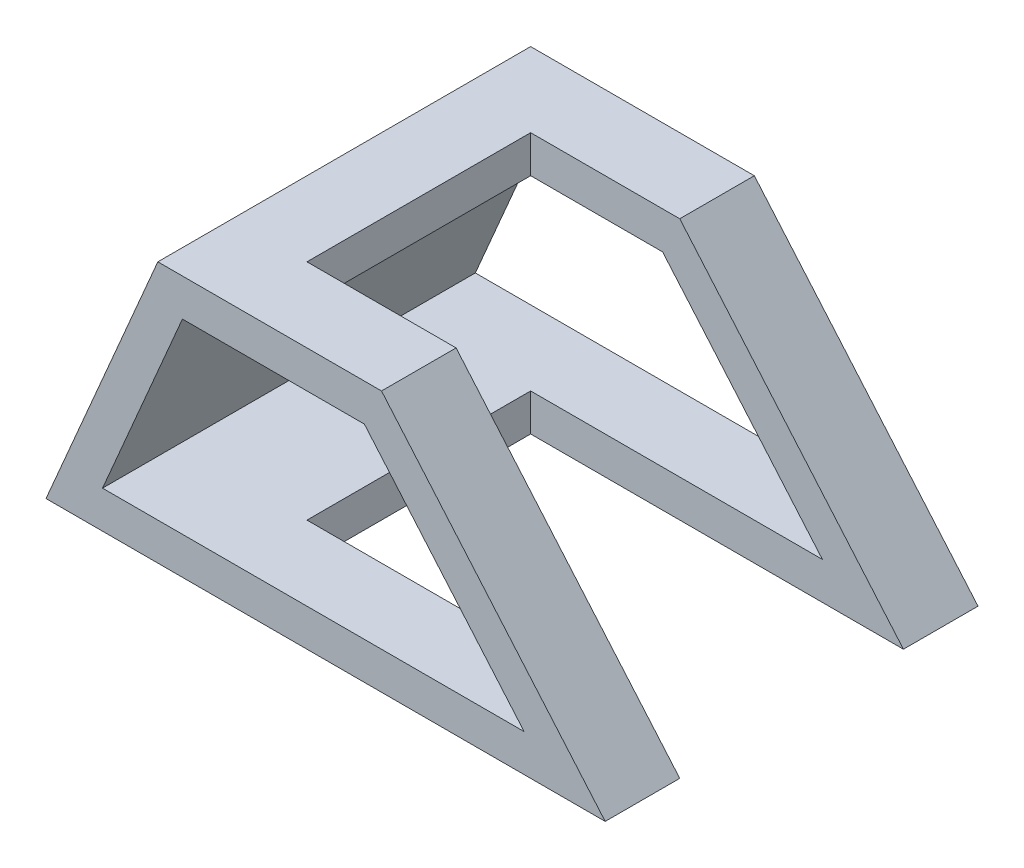
ISO-10303-21;
HEADER;
FILE_DESCRIPTION(('STEP AP214'),'2;1');
FILE_NAME('part.step','',(''),(''),'','','');
FILE_SCHEMA(('AUTOMOTIVE_DESIGN { 1 0 10303 214 1 1 1 1 }'));
ENDSEC;
DATA;
#1=APPLICATION_CONTEXT('core data for automotive mechanical design processes');
#2=APPLICATION_PROTOCOL_DEFINITION('international standard','automotive_design',2000,#1);
#3=PRODUCT_CONTEXT('',#1,'mechanical');
#4=PRODUCT('Part','Part','',(#3));
#5=PRODUCT_RELATED_PRODUCT_CATEGORY('part','',(#4));
#6=PRODUCT_DEFINITION_FORMATION('','',#4);
#7=PRODUCT_DEFINITION_CONTEXT('part definition',#1,'design');
#8=PRODUCT_DEFINITION('design','',#6,#7);
#9=PRODUCT_DEFINITION_SHAPE('','',#8);
#10=(LENGTH_UNIT() NAMED_UNIT(*) SI_UNIT(.MILLI.,.METRE.));
#11=(NAMED_UNIT(*) PLANE_ANGLE_UNIT() SI_UNIT($,.RADIAN.));
#12=(NAMED_UNIT(*) SI_UNIT($,.STERADIAN.) SOLID_ANGLE_UNIT());
#13=UNCERTAINTY_MEASURE_WITH_UNIT(LENGTH_MEASURE(1.E-05),#10,'distance_accuracy_value','');
#14=(GEOMETRIC_REPRESENTATION_CONTEXT(3) GLOBAL_UNCERTAINTY_ASSIGNED_CONTEXT((#13)) GLOBAL_UNIT_ASSIGNED_CONTEXT((#10,
#11,#12)) REPRESENTATION_CONTEXT('',''));
#15=CARTESIAN_POINT('',(0.,0.,0.));
#16=DIRECTION('',(0.,0.,1.));
#17=DIRECTION('',(1.,0.,0.));
#18=AXIS2_PLACEMENT_3D('',#15,#16,#17);
#19=CARTESIAN_POINT('',(150.,0.,100.));
#20=DIRECTION('',(-0.759256602365297,-0.650791373455968,0.));
#21=DIRECTION('',(0.650791373455968,-0.759256602365297,0.));
#22=AXIS2_PLACEMENT_3D('',#19,#20,#21);
#23=PLANE('',#22);
#24=DIRECTION('',(0.,0.,-1.));
#25=VECTOR('',#24,1.);
#26=CARTESIAN_POINT('',(90.,70.,100.));
#27=LINE('',#26,#25);
#28=CARTESIAN_POINT('',(90.,70.,20.));
#29=VERTEX_POINT('',#28);
#30=CARTESIAN_POINT('',(90.,70.,0.));
#31=VERTEX_POINT('',#30);
#32=EDGE_CURVE('E178',#29,#31,#27,.T.);
#33=ORIENTED_EDGE('',*,*,#32,.F.);
#34=DIRECTION('',(-0.650791373455968,0.759256602365297,0.));
#35=VECTOR('',#34,1.);
#36=CARTESIAN_POINT('',(150.,0.,20.));
#37=LINE('',#36,#35);
#38=CARTESIAN_POINT('',(150.,0.,20.));
#39=VERTEX_POINT('',#38);
#40=EDGE_CURVE('E161',#39,#29,#37,.T.);
#41=ORIENTED_EDGE('',*,*,#40,.F.);
#42=DIRECTION('',(0.,0.,-1.));
#43=VECTOR('',#42,1.);
#44=CARTESIAN_POINT('',(150.,0.,100.));
#45=LINE('',#44,#43);
#46=CARTESIAN_POINT('',(150.,0.,0.));
#47=VERTEX_POINT('',#46);
#48=EDGE_CURVE('E177',#39,#47,#45,.T.);
#49=ORIENTED_EDGE('',*,*,#48,.T.);
#50=DIRECTION('',(-0.650791373455968,0.759256602365297,0.));
#51=VECTOR('',#50,1.);
#52=CARTESIAN_POINT('',(150.,0.,0.));
#53=LINE('',#52,#51);
#54=EDGE_CURVE('E238',#47,#31,#53,.T.);
#55=ORIENTED_EDGE('',*,*,#54,.T.);
#56=EDGE_LOOP('',(#33,#41,#49,#55));
#57=FACE_BOUND('',#56,.T.);
#58=ADVANCED_FACE('F36',(#57),#23,.F.);
#59=CARTESIAN_POINT('',(128.257793632439,10.,100.));
#60=DIRECTION('',(-0.759256602365297,-0.650791373455968,0.));
#61=DIRECTION('',(0.650791373455968,-0.759256602365297,0.));
#62=AXIS2_PLACEMENT_3D('',#59,#60,#61);
#63=PLANE('',#62);
#64=DIRECTION('',(0.,0.,-1.));
#65=VECTOR('',#64,1.);
#66=CARTESIAN_POINT('',(128.257793632439,10.,100.));
#67=LINE('',#66,#65);
#68=CARTESIAN_POINT('',(128.257793632439,10.,20.));
#69=VERTEX_POINT('',#68);
#70=CARTESIAN_POINT('',(128.257793632439,10.,0.));
#71=VERTEX_POINT('',#70);
#72=EDGE_CURVE('E209',#69,#71,#67,.T.);
#73=ORIENTED_EDGE('',*,*,#72,.F.);
#74=DIRECTION('',(0.650791373455968,-0.759256602365297,0.));
#75=VECTOR('',#74,1.);
#76=CARTESIAN_POINT('',(128.257793632439,10.,20.));
#77=LINE('',#76,#75);
#78=CARTESIAN_POINT('',(85.4006507752959,60.,20.));
#79=VERTEX_POINT('',#78);
#80=EDGE_CURVE('E188',#79,#69,#77,.T.);
#81=ORIENTED_EDGE('',*,*,#80,.F.);
#82=DIRECTION('',(0.,0.,-1.));
#83=VECTOR('',#82,1.);
#84=CARTESIAN_POINT('',(85.4006507752959,60.,100.));
#85=LINE('',#84,#83);
#86=CARTESIAN_POINT('',(85.4006507752959,60.,0.));
#87=VERTEX_POINT('',#86);
#88=EDGE_CURVE('E210',#79,#87,#85,.T.);
#89=ORIENTED_EDGE('',*,*,#88,.T.);
#90=DIRECTION('',(-0.650791373455968,0.759256602365297,0.));
#91=VECTOR('',#90,1.);
#92=CARTESIAN_POINT('',(128.257793632439,10.,0.));
#93=LINE('',#92,#91);
#94=EDGE_CURVE('E215',#71,#87,#93,.T.);
#95=ORIENTED_EDGE('',*,*,#94,.F.);
#96=EDGE_LOOP('',(#73,#81,#89,#95));
#97=FACE_BOUND('',#96,.T.);
#98=ADVANCED_FACE('F257',(#97),#63,.T.);
#99=CARTESIAN_POINT('',(0.,0.,100.));
#100=DIRECTION('',(0.,0.,1.));
#101=DIRECTION('',(1.,0.,0.));
#102=AXIS2_PLACEMENT_3D('',#99,#100,#101);
#103=PLANE('',#102);
#104=DIRECTION('',(-0.393919298579168,-0.919145030018058,0.));
#105=VECTOR('',#104,1.);
#106=CARTESIAN_POINT('',(30.,70.,100.));
#107=LINE('',#106,#105);
#108=CARTESIAN_POINT('',(30.,70.,100.));
#109=VERTEX_POINT('',#108);
#110=CARTESIAN_POINT('',(0.,0.,100.));
#111=VERTEX_POINT('',#110);
#112=EDGE_CURVE('E224',#109,#111,#107,.T.);
#113=ORIENTED_EDGE('',*,*,#112,.T.);
#114=DIRECTION('',(1.,0.,0.));
#115=VECTOR('',#114,1.);
#116=CARTESIAN_POINT('',(0.,0.,100.));
#117=LINE('',#116,#115);
#118=CARTESIAN_POINT('',(150.,0.,100.));
#119=VERTEX_POINT('',#118);
#120=EDGE_CURVE('E227',#111,#119,#117,.T.);
#121=ORIENTED_EDGE('',*,*,#120,.T.);
#122=DIRECTION('',(-0.650791373455968,0.759256602365297,0.));
#123=VECTOR('',#122,1.);
#124=CARTESIAN_POINT('',(150.,0.,100.));
#125=LINE('',#124,#123);
#126=CARTESIAN_POINT('',(90.,70.,100.));
#127=VERTEX_POINT('',#126);
#128=EDGE_CURVE('E230',#119,#127,#125,.T.);
#129=ORIENTED_EDGE('',*,*,#128,.T.);
#130=DIRECTION('',(-1.,0.,0.));
#131=VECTOR('',#130,1.);
#132=CARTESIAN_POINT('',(90.,70.,100.));
#133=LINE('',#132,#131);
#134=EDGE_CURVE('E176',#127,#109,#133,.T.);
#135=ORIENTED_EDGE('',*,*,#134,.T.);
#136=EDGE_LOOP('',(#113,#121,#129,#135));
#137=FACE_BOUND('',#136,.T.);
#138=DIRECTION('',(-0.393919298579168,-0.919145030018058,0.));
#139=VECTOR('',#138,1.);
#140=CARTESIAN_POINT('',(36.5939615798056,60.,100.));
#141=LINE('',#140,#139);
#142=CARTESIAN_POINT('',(36.5939615798056,60.,100.));
#143=VERTEX_POINT('',#142);
#144=CARTESIAN_POINT('',(15.1653901512342,10.,100.));
#145=VERTEX_POINT('',#144);
#146=EDGE_CURVE('E261',#143,#145,#141,.T.);
#147=ORIENTED_EDGE('',*,*,#146,.F.);
#148=DIRECTION('',(-1.,0.,0.));
#149=VECTOR('',#148,1.);
#150=CARTESIAN_POINT('',(85.4006507752959,60.,100.));
#151=LINE('',#150,#149);
#152=CARTESIAN_POINT('',(85.4006507752959,60.,100.));
#153=VERTEX_POINT('',#152);
#154=EDGE_CURVE('E262',#153,#143,#151,.T.);
#155=ORIENTED_EDGE('',*,*,#154,.F.);
#156=DIRECTION('',(-0.650791373455968,0.759256602365297,0.));
#157=VECTOR('',#156,1.);
#158=CARTESIAN_POINT('',(128.257793632439,10.,100.));
#159=LINE('',#158,#157);
#160=CARTESIAN_POINT('',(128.257793632439,10.,100.));
#161=VERTEX_POINT('',#160);
#162=EDGE_CURVE('E208',#161,#153,#159,.T.);
#163=ORIENTED_EDGE('',*,*,#162,.F.);
#164=DIRECTION('',(1.,0.,0.));
#165=VECTOR('',#164,1.);
#166=CARTESIAN_POINT('',(15.1653901512342,10.,100.));
#167=LINE('',#166,#165);
#168=EDGE_CURVE('E264',#145,#161,#167,.T.);
#169=ORIENTED_EDGE('',*,*,#168,.F.);
#170=EDGE_LOOP('',(#147,#155,#163,#169));
#171=FACE_BOUND('',#170,.T.);
#172=ADVANCED_FACE('F254',(#137,#171),#103,.T.);
#173=CARTESIAN_POINT('',(0.,0.,0.));
#174=DIRECTION('',(0.,0.,1.));
#175=DIRECTION('',(1.,0.,0.));
#176=AXIS2_PLACEMENT_3D('',#173,#174,#175);
#177=PLANE('',#176);
#178=DIRECTION('',(-0.393919298579168,-0.919145030018058,0.));
#179=VECTOR('',#178,1.);
#180=CARTESIAN_POINT('',(30.,70.,0.));
#181=LINE('',#180,#179);
#182=CARTESIAN_POINT('',(30.,70.,0.));
#183=VERTEX_POINT('',#182);
#184=CARTESIAN_POINT('',(0.,0.,0.));
#185=VERTEX_POINT('',#184);
#186=EDGE_CURVE('E223',#183,#185,#181,.T.);
#187=ORIENTED_EDGE('',*,*,#186,.F.);
#188=DIRECTION('',(-1.,0.,0.));
#189=VECTOR('',#188,1.);
#190=CARTESIAN_POINT('',(90.,70.,0.));
#191=LINE('',#190,#189);
#192=EDGE_CURVE('E228',#31,#183,#191,.T.);
#193=ORIENTED_EDGE('',*,*,#192,.F.);
#194=ORIENTED_EDGE('',*,*,#54,.F.);
#195=DIRECTION('',(1.,0.,0.));
#196=VECTOR('',#195,1.);
#197=CARTESIAN_POINT('',(0.,0.,0.));
#198=LINE('',#197,#196);
#199=EDGE_CURVE('E235',#185,#47,#198,.T.);
#200=ORIENTED_EDGE('',*,*,#199,.F.);
#201=EDGE_LOOP('',(#187,#193,#194,#200));
#202=FACE_BOUND('',#201,.T.);
#203=DIRECTION('',(-1.,0.,0.));
#204=VECTOR('',#203,1.);
#205=CARTESIAN_POINT('',(85.4006507752959,60.,0.));
#206=LINE('',#205,#204);
#207=CARTESIAN_POINT('',(36.5939615798056,60.,0.));
#208=VERTEX_POINT('',#207);
#209=EDGE_CURVE('E274',#87,#208,#206,.T.);
#210=ORIENTED_EDGE('',*,*,#209,.T.);
#211=DIRECTION('',(-0.393919298579168,-0.919145030018058,0.));
#212=VECTOR('',#211,1.);
#213=CARTESIAN_POINT('',(36.5939615798056,60.,0.));
#214=LINE('',#213,#212);
#215=CARTESIAN_POINT('',(15.1653901512342,10.,0.));
#216=VERTEX_POINT('',#215);
#217=EDGE_CURVE('E277',#208,#216,#214,.T.);
#218=ORIENTED_EDGE('',*,*,#217,.T.);
#219=DIRECTION('',(1.,0.,0.));
#220=VECTOR('',#219,1.);
#221=CARTESIAN_POINT('',(15.1653901512342,10.,0.));
#222=LINE('',#221,#220);
#223=EDGE_CURVE('E280',#216,#71,#222,.T.);
#224=ORIENTED_EDGE('',*,*,#223,.T.);
#225=ORIENTED_EDGE('',*,*,#94,.T.);
#226=EDGE_LOOP('',(#210,#218,#224,#225));
#227=FACE_BOUND('',#226,.T.);
#228=ADVANCED_FACE('F250',(#202,#227),#177,.F.);
#229=CARTESIAN_POINT('',(30.,70.,100.));
#230=DIRECTION('',(0.919145030018058,-0.393919298579168,0.));
#231=DIRECTION('',(0.393919298579168,0.919145030018058,0.));
#232=AXIS2_PLACEMENT_3D('',#229,#230,#231);
#233=PLANE('',#232);
#234=ORIENTED_EDGE('',*,*,#186,.T.);
#235=DIRECTION('',(0.,0.,-1.));
#236=VECTOR('',#235,1.);
#237=CARTESIAN_POINT('',(0.,0.,100.));
#238=LINE('',#237,#236);
#239=EDGE_CURVE('E185',#111,#185,#238,.T.);
#240=ORIENTED_EDGE('',*,*,#239,.F.);
#241=ORIENTED_EDGE('',*,*,#112,.F.);
#242=DIRECTION('',(0.,0.,-1.));
#243=VECTOR('',#242,1.);
#244=CARTESIAN_POINT('',(30.,70.,100.));
#245=LINE('',#244,#243);
#246=EDGE_CURVE('E181',#109,#183,#245,.T.);
#247=ORIENTED_EDGE('',*,*,#246,.T.);
#248=EDGE_LOOP('',(#234,#240,#241,#247));
#249=FACE_BOUND('',#248,.T.);
#250=ADVANCED_FACE('F38',(#249),#233,.F.);
#251=CARTESIAN_POINT('',(0.,0.,100.));
#252=DIRECTION('',(0.,1.,0.));
#253=DIRECTION('',(0.,0.,1.));
#254=AXIS2_PLACEMENT_3D('',#251,#252,#253);
#255=PLANE('',#254);
#256=ORIENTED_EDGE('',*,*,#48,.F.);
#257=DIRECTION('',(-1.,0.,0.));
#258=VECTOR('',#257,1.);
#259=CARTESIAN_POINT('',(0.,0.,20.));
#260=LINE('',#259,#258);
#261=CARTESIAN_POINT('',(50.,0.,20.));
#262=VERTEX_POINT('',#261);
#263=EDGE_CURVE('E51',#39,#262,#260,.T.);
#264=ORIENTED_EDGE('',*,*,#263,.T.);
#265=DIRECTION('',(0.,0.,1.));
#266=VECTOR('',#265,1.);
#267=CARTESIAN_POINT('',(50.,0.,100.));
#268=LINE('',#267,#266);
#269=CARTESIAN_POINT('',(50.,0.,80.));
#270=VERTEX_POINT('',#269);
#271=EDGE_CURVE('E278',#262,#270,#268,.T.);
#272=ORIENTED_EDGE('',*,*,#271,.T.);
#273=DIRECTION('',(1.,0.,0.));
#274=VECTOR('',#273,1.);
#275=CARTESIAN_POINT('',(0.,0.,80.));
#276=LINE('',#275,#274);
#277=CARTESIAN_POINT('',(150.,0.,80.));
#278=VERTEX_POINT('',#277);
#279=EDGE_CURVE('E303',#270,#278,#276,.T.);
#280=ORIENTED_EDGE('',*,*,#279,.T.);
#281=EDGE_CURVE('E159',#119,#278,#45,.T.);
#282=ORIENTED_EDGE('',*,*,#281,.F.);
#283=ORIENTED_EDGE('',*,*,#120,.F.);
#284=ORIENTED_EDGE('',*,*,#239,.T.);
#285=ORIENTED_EDGE('',*,*,#199,.T.);
#286=EDGE_LOOP('',(#256,#264,#272,#280,#282,#283,#284,#285));
#287=FACE_BOUND('',#286,.T.);
#288=ADVANCED_FACE('F252',(#287),#255,.F.);
#289=ORIENTED_EDGE('',*,*,#281,.T.);
#290=DIRECTION('',(0.650791373455968,-0.759256602365297,0.));
#291=VECTOR('',#290,1.);
#292=CARTESIAN_POINT('',(90.,70.,80.));
#293=LINE('',#292,#291);
#294=CARTESIAN_POINT('',(90.,70.,80.));
#295=VERTEX_POINT('',#294);
#296=EDGE_CURVE('E151',#295,#278,#293,.T.);
#297=ORIENTED_EDGE('',*,*,#296,.F.);
#298=EDGE_CURVE('E156',#127,#295,#27,.T.);
#299=ORIENTED_EDGE('',*,*,#298,.F.);
#300=ORIENTED_EDGE('',*,*,#128,.F.);
#301=EDGE_LOOP('',(#289,#297,#299,#300));
#302=FACE_BOUND('',#301,.T.);
#303=ADVANCED_FACE('F153',(#302),#23,.F.);
#304=CARTESIAN_POINT('',(90.,70.,100.));
#305=DIRECTION('',(0.,-1.,0.));
#306=DIRECTION('',(1.,0.,0.));
#307=AXIS2_PLACEMENT_3D('',#304,#305,#306);
#308=PLANE('',#307);
#309=ORIENTED_EDGE('',*,*,#298,.T.);
#310=DIRECTION('',(1.,0.,0.));
#311=VECTOR('',#310,1.);
#312=CARTESIAN_POINT('',(50.,70.,80.));
#313=LINE('',#312,#311);
#314=CARTESIAN_POINT('',(50.,70.,80.));
#315=VERTEX_POINT('',#314);
#316=EDGE_CURVE('E164',#315,#295,#313,.T.);
#317=ORIENTED_EDGE('',*,*,#316,.F.);
#318=DIRECTION('',(0.,0.,1.));
#319=VECTOR('',#318,1.);
#320=CARTESIAN_POINT('',(50.,70.,20.));
#321=LINE('',#320,#319);
#322=CARTESIAN_POINT('',(50.,70.,20.));
#323=VERTEX_POINT('',#322);
#324=EDGE_CURVE('E172',#323,#315,#321,.T.);
#325=ORIENTED_EDGE('',*,*,#324,.F.);
#326=DIRECTION('',(-1.,0.,0.));
#327=VECTOR('',#326,1.);
#328=CARTESIAN_POINT('',(90.,70.,20.));
#329=LINE('',#328,#327);
#330=EDGE_CURVE('E315',#29,#323,#329,.T.);
#331=ORIENTED_EDGE('',*,*,#330,.F.);
#332=ORIENTED_EDGE('',*,*,#32,.T.);
#333=ORIENTED_EDGE('',*,*,#192,.T.);
#334=ORIENTED_EDGE('',*,*,#246,.F.);
#335=ORIENTED_EDGE('',*,*,#134,.F.);
#336=EDGE_LOOP('',(#309,#317,#325,#331,#332,#333,#334,#335));
#337=FACE_BOUND('',#336,.T.);
#338=ADVANCED_FACE('F174',(#337),#308,.F.);
#339=CARTESIAN_POINT('',(85.4006507752959,60.,100.));
#340=DIRECTION('',(0.,-1.,0.));
#341=DIRECTION('',(0.,0.,-1.));
#342=AXIS2_PLACEMENT_3D('',#339,#340,#341);
#343=PLANE('',#342);
#344=DIRECTION('',(-1.,0.,0.));
#345=VECTOR('',#344,1.);
#346=CARTESIAN_POINT('',(85.4006507752959,60.,80.));
#347=LINE('',#346,#345);
#348=CARTESIAN_POINT('',(85.4006507752959,60.,80.));
#349=VERTEX_POINT('',#348);
#350=CARTESIAN_POINT('',(50.,60.,80.));
#351=VERTEX_POINT('',#350);
#352=EDGE_CURVE('E191',#349,#351,#347,.T.);
#353=ORIENTED_EDGE('',*,*,#352,.F.);
#354=EDGE_CURVE('E202',#153,#349,#85,.T.);
#355=ORIENTED_EDGE('',*,*,#354,.F.);
#356=ORIENTED_EDGE('',*,*,#154,.T.);
#357=DIRECTION('',(0.,0.,-1.));
#358=VECTOR('',#357,1.);
#359=CARTESIAN_POINT('',(36.5939615798056,60.,100.));
#360=LINE('',#359,#358);
#361=EDGE_CURVE('E220',#143,#208,#360,.T.);
#362=ORIENTED_EDGE('',*,*,#361,.T.);
#363=ORIENTED_EDGE('',*,*,#209,.F.);
#364=ORIENTED_EDGE('',*,*,#88,.F.);
#365=DIRECTION('',(1.,0.,0.));
#366=VECTOR('',#365,1.);
#367=CARTESIAN_POINT('',(85.4006507752959,60.,20.));
#368=LINE('',#367,#366);
#369=CARTESIAN_POINT('',(50.,60.,20.));
#370=VERTEX_POINT('',#369);
#371=EDGE_CURVE('E59',#370,#79,#368,.T.);
#372=ORIENTED_EDGE('',*,*,#371,.F.);
#373=DIRECTION('',(0.,0.,-1.));
#374=VECTOR('',#373,1.);
#375=CARTESIAN_POINT('',(50.,60.,100.));
#376=LINE('',#375,#374);
#377=EDGE_CURVE('E204',#351,#370,#376,.T.);
#378=ORIENTED_EDGE('',*,*,#377,.F.);
#379=EDGE_LOOP('',(#353,#355,#356,#362,#363,#364,#372,#378));
#380=FACE_BOUND('',#379,.T.);
#381=ADVANCED_FACE('F201',(#380),#343,.T.);
#382=CARTESIAN_POINT('',(36.5939615798056,60.,100.));
#383=DIRECTION('',(0.919145030018058,-0.393919298579168,0.));
#384=DIRECTION('',(0.393919298579168,0.919145030018058,0.));
#385=AXIS2_PLACEMENT_3D('',#382,#383,#384);
#386=PLANE('',#385);
#387=ORIENTED_EDGE('',*,*,#217,.F.);
#388=ORIENTED_EDGE('',*,*,#361,.F.);
#389=ORIENTED_EDGE('',*,*,#146,.T.);
#390=DIRECTION('',(0.,0.,-1.));
#391=VECTOR('',#390,1.);
#392=CARTESIAN_POINT('',(15.1653901512342,10.,100.));
#393=LINE('',#392,#391);
#394=EDGE_CURVE('E218',#145,#216,#393,.T.);
#395=ORIENTED_EDGE('',*,*,#394,.T.);
#396=EDGE_LOOP('',(#387,#388,#389,#395));
#397=FACE_BOUND('',#396,.T.);
#398=ADVANCED_FACE('F289',(#397),#386,.T.);
#399=CARTESIAN_POINT('',(15.1653901512342,10.,100.));
#400=DIRECTION('',(0.,1.,0.));
#401=DIRECTION('',(-1.,0.,0.));
#402=AXIS2_PLACEMENT_3D('',#399,#400,#401);
#403=PLANE('',#402);
#404=DIRECTION('',(-1.,0.,0.));
#405=VECTOR('',#404,1.);
#406=CARTESIAN_POINT('',(15.1653901512342,10.,20.));
#407=LINE('',#406,#405);
#408=CARTESIAN_POINT('',(50.,10.,20.));
#409=VERTEX_POINT('',#408);
#410=EDGE_CURVE('E294',#69,#409,#407,.T.);
#411=ORIENTED_EDGE('',*,*,#410,.F.);
#412=ORIENTED_EDGE('',*,*,#72,.T.);
#413=ORIENTED_EDGE('',*,*,#223,.F.);
#414=ORIENTED_EDGE('',*,*,#394,.F.);
#415=ORIENTED_EDGE('',*,*,#168,.T.);
#416=CARTESIAN_POINT('',(128.257793632439,10.,80.));
#417=VERTEX_POINT('',#416);
#418=EDGE_CURVE('E212',#161,#417,#67,.T.);
#419=ORIENTED_EDGE('',*,*,#418,.T.);
#420=DIRECTION('',(1.,0.,0.));
#421=VECTOR('',#420,1.);
#422=CARTESIAN_POINT('',(15.1653901512342,10.,80.));
#423=LINE('',#422,#421);
#424=CARTESIAN_POINT('',(50.,10.,80.));
#425=VERTEX_POINT('',#424);
#426=EDGE_CURVE('E194',#425,#417,#423,.T.);
#427=ORIENTED_EDGE('',*,*,#426,.F.);
#428=DIRECTION('',(0.,0.,1.));
#429=VECTOR('',#428,1.);
#430=CARTESIAN_POINT('',(50.,10.,100.));
#431=LINE('',#430,#429);
#432=EDGE_CURVE('E11',#409,#425,#431,.T.);
#433=ORIENTED_EDGE('',*,*,#432,.F.);
#434=EDGE_LOOP('',(#411,#412,#413,#414,#415,#419,#427,#433));
#435=FACE_BOUND('',#434,.T.);
#436=ADVANCED_FACE('F292',(#435),#403,.T.);
#437=DIRECTION('',(-0.650791373455968,0.759256602365297,0.));
#438=VECTOR('',#437,1.);
#439=CARTESIAN_POINT('',(128.257793632439,10.,80.));
#440=LINE('',#439,#438);
#441=EDGE_CURVE('E44',#417,#349,#440,.T.);
#442=ORIENTED_EDGE('',*,*,#441,.F.);
#443=ORIENTED_EDGE('',*,*,#418,.F.);
#444=ORIENTED_EDGE('',*,*,#162,.T.);
#445=ORIENTED_EDGE('',*,*,#354,.T.);
#446=EDGE_LOOP('',(#442,#443,#444,#445));
#447=FACE_BOUND('',#446,.T.);
#448=ADVANCED_FACE('F206',(#447),#63,.T.);
#449=CARTESIAN_POINT('',(50.,-30.,20.));
#450=DIRECTION('',(-1.,0.,0.));
#451=DIRECTION('',(0.,0.,1.));
#452=AXIS2_PLACEMENT_3D('',#449,#450,#451);
#453=PLANE('',#452);
#454=ORIENTED_EDGE('',*,*,#377,.T.);
#455=DIRECTION('',(0.,1.,0.));
#456=VECTOR('',#455,1.);
#457=CARTESIAN_POINT('',(50.,-30.,20.));
#458=LINE('',#457,#456);
#459=EDGE_CURVE('E171',#370,#323,#458,.T.);
#460=ORIENTED_EDGE('',*,*,#459,.T.);
#461=ORIENTED_EDGE('',*,*,#324,.T.);
#462=DIRECTION('',(0.,1.,0.));
#463=VECTOR('',#462,1.);
#464=CARTESIAN_POINT('',(50.,-30.,80.));
#465=LINE('',#464,#463);
#466=EDGE_CURVE('E167',#351,#315,#465,.T.);
#467=ORIENTED_EDGE('',*,*,#466,.F.);
#468=EDGE_LOOP('',(#454,#460,#461,#467));
#469=FACE_BOUND('',#468,.T.);
#470=ADVANCED_FACE('F314',(#469),#453,.F.);
#471=EDGE_CURVE('E309',#262,#409,#458,.T.);
#472=ORIENTED_EDGE('',*,*,#471,.T.);
#473=ORIENTED_EDGE('',*,*,#432,.T.);
#474=EDGE_CURVE('E298',#270,#425,#465,.T.);
#475=ORIENTED_EDGE('',*,*,#474,.F.);
#476=ORIENTED_EDGE('',*,*,#271,.F.);
#477=EDGE_LOOP('',(#472,#473,#475,#476));
#478=FACE_BOUND('',#477,.T.);
#479=ADVANCED_FACE('F308',(#478),#453,.F.);
#480=CARTESIAN_POINT('',(50.,-30.,80.));
#481=DIRECTION('',(0.,0.,1.));
#482=DIRECTION('',(1.,0.,0.));
#483=AXIS2_PLACEMENT_3D('',#480,#481,#482);
#484=PLANE('',#483);
#485=ORIENTED_EDGE('',*,*,#296,.T.);
#486=ORIENTED_EDGE('',*,*,#279,.F.);
#487=ORIENTED_EDGE('',*,*,#474,.T.);
#488=ORIENTED_EDGE('',*,*,#426,.T.);
#489=ORIENTED_EDGE('',*,*,#441,.T.);
#490=ORIENTED_EDGE('',*,*,#352,.T.);
#491=ORIENTED_EDGE('',*,*,#466,.T.);
#492=ORIENTED_EDGE('',*,*,#316,.T.);
#493=EDGE_LOOP('',(#485,#486,#487,#488,#489,#490,#491,#492));
#494=FACE_BOUND('',#493,.T.);
#495=ADVANCED_FACE('F165',(#494),#484,.F.);
#496=CARTESIAN_POINT('',(90.,-30.,20.));
#497=DIRECTION('',(0.,0.,-1.));
#498=DIRECTION('',(-1.,0.,0.));
#499=AXIS2_PLACEMENT_3D('',#496,#497,#498);
#500=PLANE('',#499);
#501=ORIENTED_EDGE('',*,*,#410,.T.);
#502=ORIENTED_EDGE('',*,*,#471,.F.);
#503=ORIENTED_EDGE('',*,*,#263,.F.);
#504=ORIENTED_EDGE('',*,*,#40,.T.);
#505=ORIENTED_EDGE('',*,*,#330,.T.);
#506=ORIENTED_EDGE('',*,*,#459,.F.);
#507=ORIENTED_EDGE('',*,*,#371,.T.);
#508=ORIENTED_EDGE('',*,*,#80,.T.);
#509=EDGE_LOOP('',(#501,#502,#503,#504,#505,#506,#507,#508));
#510=FACE_BOUND('',#509,.T.);
#511=ADVANCED_FACE('F316',(#510),#500,.F.);
#512=CLOSED_SHELL('',(#58,#98,#172,#228,#250,#288,#303,#338,#381,#398,#436,#448,#470,#479,#495,#511));
#513=MANIFOLD_SOLID_BREP('B2',#512);
#514=ADVANCED_BREP_SHAPE_REPRESENTATION('',(#18,#513),#14);
#515=SHAPE_DEFINITION_REPRESENTATION(#9,#514);
ENDSEC;
END-ISO-10303-21;
